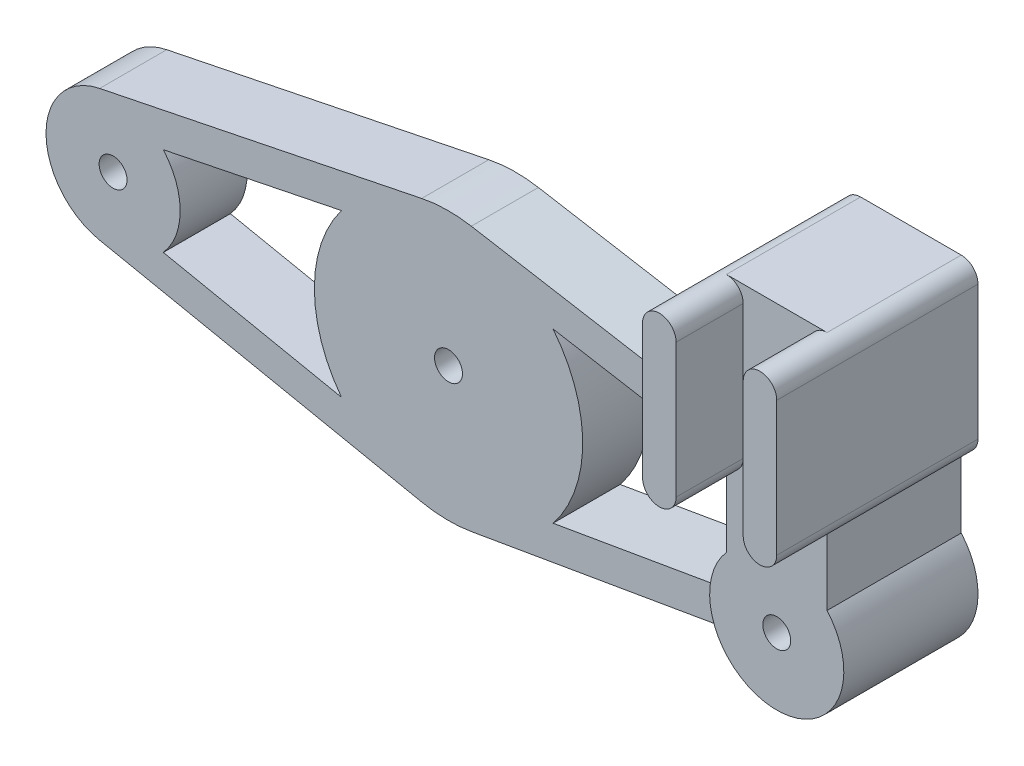
ISO-10303-21;
HEADER;
FILE_DESCRIPTION(('STEP AP214'),'2;1');
FILE_NAME('part.step','',(''),(''),'','','');
FILE_SCHEMA(('AUTOMOTIVE_DESIGN { 1 0 10303 214 1 1 1 1 }'));
ENDSEC;
DATA;
#1=APPLICATION_CONTEXT('core data for automotive mechanical design processes');
#2=APPLICATION_PROTOCOL_DEFINITION('international standard','automotive_design',2000,#1);
#3=PRODUCT_CONTEXT('',#1,'mechanical');
#4=PRODUCT('Part','Part','',(#3));
#5=PRODUCT_RELATED_PRODUCT_CATEGORY('part','',(#4));
#6=PRODUCT_DEFINITION_FORMATION('','',#4);
#7=PRODUCT_DEFINITION_CONTEXT('part definition',#1,'design');
#8=PRODUCT_DEFINITION('design','',#6,#7);
#9=PRODUCT_DEFINITION_SHAPE('','',#8);
#10=(LENGTH_UNIT() NAMED_UNIT(*) SI_UNIT(.MILLI.,.METRE.));
#11=(NAMED_UNIT(*) PLANE_ANGLE_UNIT() SI_UNIT($,.RADIAN.));
#12=(NAMED_UNIT(*) SI_UNIT($,.STERADIAN.) SOLID_ANGLE_UNIT());
#13=UNCERTAINTY_MEASURE_WITH_UNIT(LENGTH_MEASURE(1.E-05),#10,'distance_accuracy_value','');
#14=(GEOMETRIC_REPRESENTATION_CONTEXT(3) GLOBAL_UNCERTAINTY_ASSIGNED_CONTEXT((#13)) GLOBAL_UNIT_ASSIGNED_CONTEXT((#10,
#11,#12)) REPRESENTATION_CONTEXT('',''));
#15=CARTESIAN_POINT('',(0.,0.,0.));
#16=DIRECTION('',(0.,0.,1.));
#17=DIRECTION('',(1.,0.,0.));
#18=AXIS2_PLACEMENT_3D('',#15,#16,#17);
#19=CARTESIAN_POINT('',(70.7106781186548,0.,24.));
#20=DIRECTION('',(0.,0.,1.));
#21=DIRECTION('',(1.,0.,0.));
#22=AXIS2_PLACEMENT_3D('',#19,#20,#21);
#23=PLANE('',#22);
#24=CARTESIAN_POINT('',(70.7106781186548,0.,24.));
#25=DIRECTION('',(0.,0.,1.));
#26=DIRECTION('',(1.,0.,0.));
#27=AXIS2_PLACEMENT_3D('',#24,#25,#26);
#28=CIRCLE('',#27,2.5);
#29=CARTESIAN_POINT('',(73.2106781186548,0.,24.));
#30=VERTEX_POINT('',#29);
#31=EDGE_CURVE('E353',#30,#30,#28,.T.);
#32=ORIENTED_EDGE('',*,*,#31,.F.);
#33=EDGE_LOOP('',(#32));
#34=FACE_BOUND('',#33,.T.);
#35=DIRECTION('',(0.,-1.,0.));
#36=VECTOR('',#35,1.);
#37=CARTESIAN_POINT('',(79.7106781186548,7.67660141228624,24.));
#38=LINE('',#37,#36);
#39=CARTESIAN_POINT('',(79.7106781186548,21.,24.));
#40=VERTEX_POINT('',#39);
#41=CARTESIAN_POINT('',(79.7106781186548,7.93725393319377,24.));
#42=VERTEX_POINT('',#41);
#43=EDGE_CURVE('E318',#40,#42,#38,.T.);
#44=ORIENTED_EDGE('',*,*,#43,.F.);
#45=CARTESIAN_POINT('',(79.7106781186548,24.,24.));
#46=DIRECTION('',(0.,0.,1.));
#47=DIRECTION('',(1.,0.,0.));
#48=AXIS2_PLACEMENT_3D('',#45,#46,#47);
#49=CIRCLE('',#48,3.);
#50=CARTESIAN_POINT('',(76.7106781186548,24.,24.));
#51=VERTEX_POINT('',#50);
#52=EDGE_CURVE('E278',#40,#51,#49,.F.);
#53=ORIENTED_EDGE('',*,*,#52,.T.);
#54=DIRECTION('',(0.,1.,0.));
#55=VECTOR('',#54,1.);
#56=CARTESIAN_POINT('',(76.7106781186547,0.,24.));
#57=LINE('',#56,#55);
#58=CARTESIAN_POINT('',(76.7106781186548,48.,24.));
#59=VERTEX_POINT('',#58);
#60=EDGE_CURVE('E11',#51,#59,#57,.T.);
#61=ORIENTED_EDGE('',*,*,#60,.T.);
#62=CARTESIAN_POINT('',(79.7106781186548,48.,24.));
#63=DIRECTION('',(0.,0.,1.));
#64=DIRECTION('',(1.,0.,0.));
#65=AXIS2_PLACEMENT_3D('',#62,#63,#64);
#66=CIRCLE('',#65,2.99999999999998);
#67=CARTESIAN_POINT('',(79.7106781186548,51.,24.));
#68=VERTEX_POINT('',#67);
#69=EDGE_CURVE('E275',#59,#68,#66,.F.);
#70=ORIENTED_EDGE('',*,*,#69,.T.);
#71=DIRECTION('',(1.,0.,0.));
#72=VECTOR('',#71,1.);
#73=CARTESIAN_POINT('',(79.7106781186547,51.,24.));
#74=LINE('',#73,#72);
#75=CARTESIAN_POINT('',(61.7106781186547,51.,24.));
#76=VERTEX_POINT('',#75);
#77=EDGE_CURVE('E322',#76,#68,#74,.T.);
#78=ORIENTED_EDGE('',*,*,#77,.F.);
#79=CARTESIAN_POINT('',(61.7106781186547,48.,24.));
#80=DIRECTION('',(0.,0.,1.));
#81=DIRECTION('',(1.,0.,0.));
#82=AXIS2_PLACEMENT_3D('',#79,#80,#81);
#83=CIRCLE('',#82,2.99999999999998);
#84=CARTESIAN_POINT('',(64.7106781186547,48.,24.));
#85=VERTEX_POINT('',#84);
#86=EDGE_CURVE('E57',#76,#85,#83,.F.);
#87=ORIENTED_EDGE('',*,*,#86,.T.);
#88=DIRECTION('',(0.,-1.,0.));
#89=VECTOR('',#88,1.);
#90=CARTESIAN_POINT('',(64.7106781186548,0.,24.));
#91=LINE('',#90,#89);
#92=CARTESIAN_POINT('',(64.7106781186547,24.,24.));
#93=VERTEX_POINT('',#92);
#94=EDGE_CURVE('E52',#85,#93,#91,.T.);
#95=ORIENTED_EDGE('',*,*,#94,.T.);
#96=CARTESIAN_POINT('',(61.7106781186547,24.,24.));
#97=DIRECTION('',(0.,0.,1.));
#98=DIRECTION('',(1.,0.,0.));
#99=AXIS2_PLACEMENT_3D('',#96,#97,#98);
#100=CIRCLE('',#99,3.);
#101=CARTESIAN_POINT('',(61.7106781186547,21.,24.));
#102=VERTEX_POINT('',#101);
#103=EDGE_CURVE('E309',#93,#102,#100,.F.);
#104=ORIENTED_EDGE('',*,*,#103,.T.);
#105=DIRECTION('',(0.,1.,0.));
#106=VECTOR('',#105,1.);
#107=CARTESIAN_POINT('',(61.7106781186547,51.,24.));
#108=LINE('',#107,#106);
#109=CARTESIAN_POINT('',(61.7106781186547,7.93725393319376,24.));
#110=VERTEX_POINT('',#109);
#111=EDGE_CURVE('E313',#110,#102,#108,.T.);
#112=ORIENTED_EDGE('',*,*,#111,.F.);
#113=CARTESIAN_POINT('',(70.7106781186548,0.,24.));
#114=DIRECTION('',(0.,0.,1.));
#115=DIRECTION('',(1.,0.,0.));
#116=AXIS2_PLACEMENT_3D('',#113,#114,#115);
#117=CIRCLE('',#116,12.);
#118=EDGE_CURVE('E360',#110,#42,#117,.T.);
#119=ORIENTED_EDGE('',*,*,#118,.T.);
#120=EDGE_LOOP('',(#44,#53,#61,#70,#78,#87,#95,#104,#112,#119));
#121=FACE_BOUND('',#120,.T.);
#122=ADVANCED_FACE('F37',(#34,#121),#23,.T.);
#123=CARTESIAN_POINT('',(79.7106781186548,7.67660141228624,70.9139303958847));
#124=DIRECTION('',(1.,0.,0.));
#125=DIRECTION('',(0.,1.,0.));
#126=AXIS2_PLACEMENT_3D('',#123,#124,#125);
#127=PLANE('',#126);
#128=DIRECTION('',(0.,-1.,0.));
#129=VECTOR('',#128,1.);
#130=CARTESIAN_POINT('',(79.7106781186548,7.67660141228624,0.));
#131=LINE('',#130,#129);
#132=CARTESIAN_POINT('',(79.7106781186548,21.,0.));
#133=VERTEX_POINT('',#132);
#134=CARTESIAN_POINT('',(79.7106781186548,7.93725393319377,0.));
#135=VERTEX_POINT('',#134);
#136=EDGE_CURVE('E311',#133,#135,#131,.T.);
#137=ORIENTED_EDGE('',*,*,#136,.F.);
#138=DIRECTION('',(0.,0.,-1.));
#139=VECTOR('',#138,1.);
#140=CARTESIAN_POINT('',(79.7106781186548,21.,36.));
#141=LINE('',#140,#139);
#142=EDGE_CURVE('E45',#133,#40,#141,.F.);
#143=ORIENTED_EDGE('',*,*,#142,.T.);
#144=ORIENTED_EDGE('',*,*,#43,.T.);
#145=DIRECTION('',(0.,0.,-1.));
#146=VECTOR('',#145,1.);
#147=CARTESIAN_POINT('',(79.7106781186548,7.93725393319377,12.));
#148=LINE('',#147,#146);
#149=EDGE_CURVE('E320',#135,#42,#148,.F.);
#150=ORIENTED_EDGE('',*,*,#149,.F.);
#151=EDGE_LOOP('',(#137,#143,#144,#150));
#152=FACE_BOUND('',#151,.T.);
#153=ADVANCED_FACE('F485',(#152),#127,.T.);
#154=CARTESIAN_POINT('',(61.7106781186547,51.,70.9139303958847));
#155=DIRECTION('',(-1.,0.,0.));
#156=DIRECTION('',(0.,-1.,0.));
#157=AXIS2_PLACEMENT_3D('',#154,#155,#156);
#158=PLANE('',#157);
#159=ORIENTED_EDGE('',*,*,#111,.T.);
#160=DIRECTION('',(0.,0.,-1.));
#161=VECTOR('',#160,1.);
#162=CARTESIAN_POINT('',(61.7106781186547,21.,36.));
#163=LINE('',#162,#161);
#164=CARTESIAN_POINT('',(61.7106781186547,21.,0.));
#165=VERTEX_POINT('',#164);
#166=EDGE_CURVE('E479',#102,#165,#163,.T.);
#167=ORIENTED_EDGE('',*,*,#166,.T.);
#168=DIRECTION('',(0.,1.,0.));
#169=VECTOR('',#168,1.);
#170=CARTESIAN_POINT('',(61.7106781186547,51.,0.));
#171=LINE('',#170,#169);
#172=CARTESIAN_POINT('',(61.7106781186547,13.7264556374348,0.));
#173=VERTEX_POINT('',#172);
#174=EDGE_CURVE('E314',#173,#165,#171,.T.);
#175=ORIENTED_EDGE('',*,*,#174,.F.);
#176=DIRECTION('',(0.,0.,-1.));
#177=VECTOR('',#176,1.);
#178=CARTESIAN_POINT('',(61.7106781186547,13.7264556374348,12.));
#179=LINE('',#178,#177);
#180=CARTESIAN_POINT('',(61.7106781186547,13.7264556374348,12.));
#181=VERTEX_POINT('',#180);
#182=EDGE_CURVE('E333',#181,#173,#179,.T.);
#183=ORIENTED_EDGE('',*,*,#182,.F.);
#184=DIRECTION('',(0.,-1.,0.));
#185=VECTOR('',#184,1.);
#186=CARTESIAN_POINT('',(61.7106781186547,0.,12.));
#187=LINE('',#186,#185);
#188=CARTESIAN_POINT('',(61.7106781186547,7.93725393319376,12.));
#189=VERTEX_POINT('',#188);
#190=EDGE_CURVE('E336',#181,#189,#187,.T.);
#191=ORIENTED_EDGE('',*,*,#190,.T.);
#192=DIRECTION('',(0.,0.,-1.));
#193=VECTOR('',#192,1.);
#194=CARTESIAN_POINT('',(61.7106781186547,7.93725393319376,12.));
#195=LINE('',#194,#193);
#196=EDGE_CURVE('E338',#110,#189,#195,.T.);
#197=ORIENTED_EDGE('',*,*,#196,.F.);
#198=EDGE_LOOP('',(#159,#167,#175,#183,#191,#197));
#199=FACE_BOUND('',#198,.T.);
#200=ADVANCED_FACE('F524',(#199),#158,.T.);
#201=CARTESIAN_POINT('',(-60.,0.,12.));
#202=DIRECTION('',(0.,0.,1.));
#203=DIRECTION('',(1.,0.,0.));
#204=AXIS2_PLACEMENT_3D('',#201,#202,#203);
#205=PLANE('',#204);
#206=ORIENTED_EDGE('',*,*,#190,.F.);
#207=DIRECTION('',(-0.985494799580394,0.169705627484771,0.));
#208=VECTOR('',#207,1.);
#209=CARTESIAN_POINT('',(4.07293505963451,23.6518751899294,12.));
#210=LINE('',#209,#208);
#211=CARTESIAN_POINT('',(4.07293505963451,23.6518751899294,12.));
#212=VERTEX_POINT('',#211);
#213=EDGE_CURVE('E436',#181,#212,#210,.T.);
#214=ORIENTED_EDGE('',*,*,#213,.T.);
#215=CARTESIAN_POINT('',(0.,0.,12.));
#216=DIRECTION('',(0.,0.,1.));
#217=DIRECTION('',(1.,0.,0.));
#218=AXIS2_PLACEMENT_3D('',#215,#216,#217);
#219=CIRCLE('',#218,24.);
#220=CARTESIAN_POINT('',(-4.8,23.5151015307185,12.));
#221=VERTEX_POINT('',#220);
#222=EDGE_CURVE('E438',#212,#221,#219,.T.);
#223=ORIENTED_EDGE('',*,*,#222,.T.);
#224=DIRECTION('',(-0.979795897113271,-0.2,0.));
#225=VECTOR('',#224,1.);
#226=CARTESIAN_POINT('',(-62.4,11.7575507653593,12.));
#227=LINE('',#226,#225);
#228=CARTESIAN_POINT('',(-62.4,11.7575507653593,12.));
#229=VERTEX_POINT('',#228);
#230=EDGE_CURVE('E440',#221,#229,#227,.T.);
#231=ORIENTED_EDGE('',*,*,#230,.T.);
#232=CARTESIAN_POINT('',(-60.,0.,12.));
#233=DIRECTION('',(0.,0.,1.));
#234=DIRECTION('',(1.,0.,0.));
#235=AXIS2_PLACEMENT_3D('',#232,#233,#234);
#236=CIRCLE('',#235,12.);
#237=CARTESIAN_POINT('',(-62.4,-11.7575507653593,12.));
#238=VERTEX_POINT('',#237);
#239=EDGE_CURVE('E426',#229,#238,#236,.T.);
#240=ORIENTED_EDGE('',*,*,#239,.T.);
#241=DIRECTION('',(0.979795897113271,-0.2,0.));
#242=VECTOR('',#241,1.);
#243=CARTESIAN_POINT('',(-62.4,-11.7575507653593,12.));
#244=LINE('',#243,#242);
#245=CARTESIAN_POINT('',(-4.8,-23.5151015307185,12.));
#246=VERTEX_POINT('',#245);
#247=EDGE_CURVE('E429',#238,#246,#244,.T.);
#248=ORIENTED_EDGE('',*,*,#247,.T.);
#249=CARTESIAN_POINT('',(0.,0.,12.));
#250=DIRECTION('',(0.,0.,1.));
#251=DIRECTION('',(1.,0.,0.));
#252=AXIS2_PLACEMENT_3D('',#249,#250,#251);
#253=CIRCLE('',#252,24.);
#254=CARTESIAN_POINT('',(4.0729350596345,-23.6518751899294,12.));
#255=VERTEX_POINT('',#254);
#256=EDGE_CURVE('E432',#246,#255,#253,.T.);
#257=ORIENTED_EDGE('',*,*,#256,.T.);
#258=DIRECTION('',(0.985494799580394,0.169705627484772,0.));
#259=VECTOR('',#258,1.);
#260=CARTESIAN_POINT('',(72.747145648472,-11.8259375949647,12.));
#261=LINE('',#260,#259);
#262=CARTESIAN_POINT('',(72.747145648472,-11.8259375949647,12.));
#263=VERTEX_POINT('',#262);
#264=EDGE_CURVE('E434',#255,#263,#261,.T.);
#265=ORIENTED_EDGE('',*,*,#264,.T.);
#266=CARTESIAN_POINT('',(70.7106781186548,0.,12.));
#267=DIRECTION('',(0.,0.,1.));
#268=DIRECTION('',(1.,0.,0.));
#269=AXIS2_PLACEMENT_3D('',#266,#267,#268);
#270=CIRCLE('',#269,12.);
#271=CARTESIAN_POINT('',(61.4873495027545,-7.67660141228625,12.));
#272=VERTEX_POINT('',#271);
#273=EDGE_CURVE('E365',#272,#263,#270,.T.);
#274=ORIENTED_EDGE('',*,*,#273,.F.);
#275=DIRECTION('',(0.985494799580394,0.169705627484771,0.));
#276=VECTOR('',#275,1.);
#277=CARTESIAN_POINT('',(61.4873495027545,-7.67660141228625,12.));
#278=LINE('',#277,#276);
#279=CARTESIAN_POINT('',(18.6989462429489,-15.0449130739698,12.));
#280=VERTEX_POINT('',#279);
#281=EDGE_CURVE('E368',#280,#272,#278,.T.);
#282=ORIENTED_EDGE('',*,*,#281,.F.);
#283=CARTESIAN_POINT('',(0.,0.,12.));
#284=DIRECTION('',(0.,0.,-1.));
#285=DIRECTION('',(1.,0.,0.));
#286=AXIS2_PLACEMENT_3D('',#283,#284,#285);
#287=CIRCLE('',#286,24.);
#288=CARTESIAN_POINT('',(18.6989462429489,15.0449130739698,12.));
#289=VERTEX_POINT('',#288);
#290=EDGE_CURVE('E366',#289,#280,#287,.T.);
#291=ORIENTED_EDGE('',*,*,#290,.F.);
#292=DIRECTION('',(-0.985494799580394,0.169705627484771,0.));
#293=VECTOR('',#292,1.);
#294=CARTESIAN_POINT('',(18.6989462429489,15.0449130739698,12.));
#295=LINE('',#294,#293);
#296=CARTESIAN_POINT('',(61.4873495027545,7.67660141228625,12.));
#297=VERTEX_POINT('',#296);
#298=EDGE_CURVE('E372',#297,#289,#295,.T.);
#299=ORIENTED_EDGE('',*,*,#298,.F.);
#300=EDGE_CURVE('E359',#189,#297,#270,.T.);
#301=ORIENTED_EDGE('',*,*,#300,.F.);
#302=EDGE_LOOP('',(#206,#214,#223,#231,#240,#248,#257,#265,#274,#282,#291,#299,#301));
#303=FACE_BOUND('',#302,.T.);
#304=CARTESIAN_POINT('',(-60.,0.,12.));
#305=DIRECTION('',(0.,0.,1.));
#306=DIRECTION('',(1.,0.,0.));
#307=AXIS2_PLACEMENT_3D('',#304,#305,#306);
#308=CIRCLE('',#307,2.5);
#309=CARTESIAN_POINT('',(-57.5,0.,12.));
#310=VERTEX_POINT('',#309);
#311=EDGE_CURVE('E344',#310,#310,#308,.T.);
#312=ORIENTED_EDGE('',*,*,#311,.F.);
#313=EDGE_LOOP('',(#312));
#314=FACE_BOUND('',#313,.T.);
#315=CARTESIAN_POINT('',(0.,0.,12.));
#316=DIRECTION('',(0.,0.,1.));
#317=DIRECTION('',(1.,0.,0.));
#318=AXIS2_PLACEMENT_3D('',#315,#316,#317);
#319=CIRCLE('',#318,2.5);
#320=CARTESIAN_POINT('',(2.5,0.,12.));
#321=VERTEX_POINT('',#320);
#322=EDGE_CURVE('E350',#321,#321,#319,.T.);
#323=ORIENTED_EDGE('',*,*,#322,.F.);
#324=EDGE_LOOP('',(#323));
#325=FACE_BOUND('',#324,.T.);
#326=DIRECTION('',(-0.979795897113271,-0.2,0.));
#327=VECTOR('',#326,1.);
#328=CARTESIAN_POINT('',(-51.0176623509137,7.95723635176228,12.));
#329=LINE('',#328,#327);
#330=CARTESIAN_POINT('',(-19.1537776761789,14.4614245747614,12.));
#331=VERTEX_POINT('',#330);
#332=CARTESIAN_POINT('',(-51.0176623509137,7.95723635176228,12.));
#333=VERTEX_POINT('',#332);
#334=EDGE_CURVE('E397',#331,#333,#329,.T.);
#335=ORIENTED_EDGE('',*,*,#334,.F.);
#336=CARTESIAN_POINT('',(0.,0.,12.));
#337=DIRECTION('',(0.,0.,-1.));
#338=DIRECTION('',(1.,0.,0.));
#339=AXIS2_PLACEMENT_3D('',#336,#337,#338);
#340=CIRCLE('',#339,24.);
#341=CARTESIAN_POINT('',(-19.1537776761789,-14.4614245747614,12.));
#342=VERTEX_POINT('',#341);
#343=EDGE_CURVE('E395',#342,#331,#340,.T.);
#344=ORIENTED_EDGE('',*,*,#343,.F.);
#345=DIRECTION('',(0.979795897113271,-0.2,0.));
#346=VECTOR('',#345,1.);
#347=CARTESIAN_POINT('',(-51.0176623509137,-7.95723635176228,12.));
#348=LINE('',#347,#346);
#349=CARTESIAN_POINT('',(-51.0176623509137,-7.95723635176228,12.));
#350=VERTEX_POINT('',#349);
#351=EDGE_CURVE('E403',#350,#342,#348,.T.);
#352=ORIENTED_EDGE('',*,*,#351,.F.);
#353=CARTESIAN_POINT('',(-60.,0.,12.));
#354=DIRECTION('',(0.,0.,-1.));
#355=DIRECTION('',(1.,0.,0.));
#356=AXIS2_PLACEMENT_3D('',#353,#354,#355);
#357=CIRCLE('',#356,12.);
#358=EDGE_CURVE('E400',#333,#350,#357,.T.);
#359=ORIENTED_EDGE('',*,*,#358,.F.);
#360=EDGE_LOOP('',(#335,#344,#352,#359));
#361=FACE_BOUND('',#360,.T.);
#362=ADVANCED_FACE('F528',(#303,#314,#325,#361),#205,.T.);
#363=CARTESIAN_POINT('',(-60.,0.,0.));
#364=DIRECTION('',(0.,0.,1.));
#365=DIRECTION('',(1.,0.,0.));
#366=AXIS2_PLACEMENT_3D('',#363,#364,#365);
#367=PLANE('',#366);
#368=DIRECTION('',(1.,0.,0.));
#369=VECTOR('',#368,1.);
#370=CARTESIAN_POINT('',(79.7106781186547,51.,0.));
#371=LINE('',#370,#369);
#372=CARTESIAN_POINT('',(61.7106781186547,51.,0.));
#373=VERTEX_POINT('',#372);
#374=CARTESIAN_POINT('',(79.7106781186547,51.,0.));
#375=VERTEX_POINT('',#374);
#376=EDGE_CURVE('E241',#373,#375,#371,.T.);
#377=ORIENTED_EDGE('',*,*,#376,.T.);
#378=CARTESIAN_POINT('',(79.7106781186548,48.,0.));
#379=DIRECTION('',(0.,0.,1.));
#380=DIRECTION('',(1.,0.,0.));
#381=AXIS2_PLACEMENT_3D('',#378,#379,#380);
#382=CIRCLE('',#381,2.99999999999998);
#383=CARTESIAN_POINT('',(82.7106781186547,48.,0.));
#384=VERTEX_POINT('',#383);
#385=EDGE_CURVE('E232',#375,#384,#382,.F.);
#386=ORIENTED_EDGE('',*,*,#385,.T.);
#387=DIRECTION('',(0.,-1.,0.));
#388=VECTOR('',#387,1.);
#389=CARTESIAN_POINT('',(82.7106781186548,24.,0.));
#390=LINE('',#389,#388);
#391=CARTESIAN_POINT('',(82.7106781186548,24.,0.));
#392=VERTEX_POINT('',#391);
#393=EDGE_CURVE('E238',#384,#392,#390,.T.);
#394=ORIENTED_EDGE('',*,*,#393,.T.);
#395=CARTESIAN_POINT('',(79.7106781186548,24.,0.));
#396=DIRECTION('',(0.,0.,1.));
#397=DIRECTION('',(1.,0.,0.));
#398=AXIS2_PLACEMENT_3D('',#395,#396,#397);
#399=CIRCLE('',#398,3.);
#400=EDGE_CURVE('E244',#392,#133,#399,.F.);
#401=ORIENTED_EDGE('',*,*,#400,.T.);
#402=ORIENTED_EDGE('',*,*,#136,.T.);
#403=CARTESIAN_POINT('',(70.7106781186548,0.,0.));
#404=DIRECTION('',(0.,0.,1.));
#405=DIRECTION('',(1.,0.,0.));
#406=AXIS2_PLACEMENT_3D('',#403,#404,#405);
#407=CIRCLE('',#406,12.);
#408=CARTESIAN_POINT('',(72.747145648472,-11.8259375949647,0.));
#409=VERTEX_POINT('',#408);
#410=EDGE_CURVE('E451',#409,#135,#407,.T.);
#411=ORIENTED_EDGE('',*,*,#410,.F.);
#412=DIRECTION('',(0.985494799580394,0.169705627484772,0.));
#413=VECTOR('',#412,1.);
#414=CARTESIAN_POINT('',(72.747145648472,-11.8259375949647,0.));
#415=LINE('',#414,#413);
#416=CARTESIAN_POINT('',(4.0729350596345,-23.6518751899294,0.));
#417=VERTEX_POINT('',#416);
#418=EDGE_CURVE('E449',#417,#409,#415,.T.);
#419=ORIENTED_EDGE('',*,*,#418,.F.);
#420=CARTESIAN_POINT('',(0.,0.,0.));
#421=DIRECTION('',(0.,0.,1.));
#422=DIRECTION('',(1.,0.,0.));
#423=AXIS2_PLACEMENT_3D('',#420,#421,#422);
#424=CIRCLE('',#423,24.);
#425=CARTESIAN_POINT('',(-4.8,-23.5151015307185,0.));
#426=VERTEX_POINT('',#425);
#427=EDGE_CURVE('E447',#426,#417,#424,.T.);
#428=ORIENTED_EDGE('',*,*,#427,.F.);
#429=DIRECTION('',(0.979795897113271,-0.2,0.));
#430=VECTOR('',#429,1.);
#431=CARTESIAN_POINT('',(-62.4,-11.7575507653593,0.));
#432=LINE('',#431,#430);
#433=CARTESIAN_POINT('',(-62.4,-11.7575507653593,0.));
#434=VERTEX_POINT('',#433);
#435=EDGE_CURVE('E445',#434,#426,#432,.T.);
#436=ORIENTED_EDGE('',*,*,#435,.F.);
#437=CARTESIAN_POINT('',(-60.,0.,0.));
#438=DIRECTION('',(0.,0.,1.));
#439=DIRECTION('',(1.,0.,0.));
#440=AXIS2_PLACEMENT_3D('',#437,#438,#439);
#441=CIRCLE('',#440,12.);
#442=CARTESIAN_POINT('',(-62.4,11.7575507653593,0.));
#443=VERTEX_POINT('',#442);
#444=EDGE_CURVE('E425',#443,#434,#441,.T.);
#445=ORIENTED_EDGE('',*,*,#444,.F.);
#446=DIRECTION('',(-0.979795897113271,-0.2,0.));
#447=VECTOR('',#446,1.);
#448=CARTESIAN_POINT('',(-62.4,11.7575507653593,0.));
#449=LINE('',#448,#447);
#450=CARTESIAN_POINT('',(-4.8,23.5151015307185,0.));
#451=VERTEX_POINT('',#450);
#452=EDGE_CURVE('E430',#451,#443,#449,.T.);
#453=ORIENTED_EDGE('',*,*,#452,.F.);
#454=CARTESIAN_POINT('',(0.,0.,0.));
#455=DIRECTION('',(0.,0.,1.));
#456=DIRECTION('',(1.,0.,0.));
#457=AXIS2_PLACEMENT_3D('',#454,#455,#456);
#458=CIRCLE('',#457,24.);
#459=CARTESIAN_POINT('',(4.07293505963451,23.6518751899294,0.));
#460=VERTEX_POINT('',#459);
#461=EDGE_CURVE('E456',#460,#451,#458,.T.);
#462=ORIENTED_EDGE('',*,*,#461,.F.);
#463=DIRECTION('',(-0.985494799580394,0.169705627484771,0.));
#464=VECTOR('',#463,1.);
#465=CARTESIAN_POINT('',(4.07293505963451,23.6518751899294,0.));
#466=LINE('',#465,#464);
#467=EDGE_CURVE('E454',#173,#460,#466,.T.);
#468=ORIENTED_EDGE('',*,*,#467,.F.);
#469=ORIENTED_EDGE('',*,*,#174,.T.);
#470=CARTESIAN_POINT('',(61.7106781186547,24.,0.));
#471=DIRECTION('',(0.,0.,1.));
#472=DIRECTION('',(1.,0.,0.));
#473=AXIS2_PLACEMENT_3D('',#470,#471,#472);
#474=CIRCLE('',#473,3.);
#475=CARTESIAN_POINT('',(58.7106781186547,24.,0.));
#476=VERTEX_POINT('',#475);
#477=EDGE_CURVE('E286',#165,#476,#474,.F.);
#478=ORIENTED_EDGE('',*,*,#477,.T.);
#479=DIRECTION('',(0.,1.,0.));
#480=VECTOR('',#479,1.);
#481=CARTESIAN_POINT('',(58.7106781186547,24.,0.));
#482=LINE('',#481,#480);
#483=CARTESIAN_POINT('',(58.7106781186548,48.,0.));
#484=VERTEX_POINT('',#483);
#485=EDGE_CURVE('E283',#476,#484,#482,.T.);
#486=ORIENTED_EDGE('',*,*,#485,.T.);
#487=CARTESIAN_POINT('',(61.7106781186547,48.,0.));
#488=DIRECTION('',(0.,0.,1.));
#489=DIRECTION('',(1.,0.,0.));
#490=AXIS2_PLACEMENT_3D('',#487,#488,#489);
#491=CIRCLE('',#490,2.99999999999998);
#492=EDGE_CURVE('E281',#484,#373,#491,.F.);
#493=ORIENTED_EDGE('',*,*,#492,.T.);
#494=EDGE_LOOP('',(#377,#386,#394,#401,#402,#411,#419,#428,#436,#445,#453,#462,#468,#469,#478,
#486,#493));
#495=FACE_BOUND('',#494,.T.);
#496=CARTESIAN_POINT('',(0.,0.,0.));
#497=DIRECTION('',(0.,0.,-1.));
#498=DIRECTION('',(1.,0.,0.));
#499=AXIS2_PLACEMENT_3D('',#496,#497,#498);
#500=CIRCLE('',#499,24.);
#501=CARTESIAN_POINT('',(18.6989462429489,15.0449130739698,0.));
#502=VERTEX_POINT('',#501);
#503=CARTESIAN_POINT('',(18.6989462429489,-15.0449130739698,0.));
#504=VERTEX_POINT('',#503);
#505=EDGE_CURVE('E363',#502,#504,#500,.T.);
#506=ORIENTED_EDGE('',*,*,#505,.T.);
#507=DIRECTION('',(0.985494799580394,0.169705627484771,0.));
#508=VECTOR('',#507,1.);
#509=CARTESIAN_POINT('',(61.4873495027545,-7.67660141228625,0.));
#510=LINE('',#509,#508);
#511=CARTESIAN_POINT('',(61.4873495027545,-7.67660141228625,0.));
#512=VERTEX_POINT('',#511);
#513=EDGE_CURVE('E377',#504,#512,#510,.T.);
#514=ORIENTED_EDGE('',*,*,#513,.T.);
#515=CARTESIAN_POINT('',(70.7106781186548,0.,0.));
#516=DIRECTION('',(0.,0.,-1.));
#517=DIRECTION('',(1.,0.,0.));
#518=AXIS2_PLACEMENT_3D('',#515,#516,#517);
#519=CIRCLE('',#518,12.);
#520=CARTESIAN_POINT('',(61.4873495027545,7.67660141228624,0.));
#521=VERTEX_POINT('',#520);
#522=EDGE_CURVE('E380',#512,#521,#519,.T.);
#523=ORIENTED_EDGE('',*,*,#522,.T.);
#524=DIRECTION('',(-0.985494799580394,0.169705627484771,0.));
#525=VECTOR('',#524,1.);
#526=CARTESIAN_POINT('',(18.6989462429489,15.0449130739698,0.));
#527=LINE('',#526,#525);
#528=EDGE_CURVE('E369',#521,#502,#527,.T.);
#529=ORIENTED_EDGE('',*,*,#528,.T.);
#530=EDGE_LOOP('',(#506,#514,#523,#529));
#531=FACE_BOUND('',#530,.T.);
#532=CARTESIAN_POINT('',(0.,0.,0.));
#533=DIRECTION('',(0.,0.,-1.));
#534=DIRECTION('',(1.,0.,0.));
#535=AXIS2_PLACEMENT_3D('',#532,#533,#534);
#536=CIRCLE('',#535,24.);
#537=CARTESIAN_POINT('',(-19.1537776761789,-14.4614245747614,0.));
#538=VERTEX_POINT('',#537);
#539=CARTESIAN_POINT('',(-19.1537776761789,14.4614245747614,0.));
#540=VERTEX_POINT('',#539);
#541=EDGE_CURVE('E394',#538,#540,#536,.T.);
#542=ORIENTED_EDGE('',*,*,#541,.T.);
#543=DIRECTION('',(-0.979795897113271,-0.2,0.));
#544=VECTOR('',#543,1.);
#545=CARTESIAN_POINT('',(-51.0176623509137,7.95723635176228,0.));
#546=LINE('',#545,#544);
#547=CARTESIAN_POINT('',(-51.0176623509137,7.95723635176228,0.));
#548=VERTEX_POINT('',#547);
#549=EDGE_CURVE('E408',#540,#548,#546,.T.);
#550=ORIENTED_EDGE('',*,*,#549,.T.);
#551=CARTESIAN_POINT('',(-60.,0.,0.));
#552=DIRECTION('',(0.,0.,-1.));
#553=DIRECTION('',(1.,0.,0.));
#554=AXIS2_PLACEMENT_3D('',#551,#552,#553);
#555=CIRCLE('',#554,12.);
#556=CARTESIAN_POINT('',(-51.0176623509137,-7.95723635176228,0.));
#557=VERTEX_POINT('',#556);
#558=EDGE_CURVE('E411',#548,#557,#555,.T.);
#559=ORIENTED_EDGE('',*,*,#558,.T.);
#560=DIRECTION('',(0.979795897113271,-0.2,0.));
#561=VECTOR('',#560,1.);
#562=CARTESIAN_POINT('',(-51.0176623509137,-7.95723635176228,0.));
#563=LINE('',#562,#561);
#564=EDGE_CURVE('E398',#557,#538,#563,.T.);
#565=ORIENTED_EDGE('',*,*,#564,.T.);
#566=EDGE_LOOP('',(#542,#550,#559,#565));
#567=FACE_BOUND('',#566,.T.);
#568=CARTESIAN_POINT('',(70.7106781186548,0.,0.));
#569=DIRECTION('',(0.,0.,1.));
#570=DIRECTION('',(1.,0.,0.));
#571=AXIS2_PLACEMENT_3D('',#568,#569,#570);
#572=CIRCLE('',#571,2.49999999999999);
#573=CARTESIAN_POINT('',(73.2106781186547,0.,0.));
#574=VERTEX_POINT('',#573);
#575=EDGE_CURVE('E356',#574,#574,#572,.T.);
#576=ORIENTED_EDGE('',*,*,#575,.T.);
#577=EDGE_LOOP('',(#576));
#578=FACE_BOUND('',#577,.T.);
#579=CARTESIAN_POINT('',(0.,0.,0.));
#580=DIRECTION('',(0.,0.,1.));
#581=DIRECTION('',(1.,0.,0.));
#582=AXIS2_PLACEMENT_3D('',#579,#580,#581);
#583=CIRCLE('',#582,2.49999999999999);
#584=CARTESIAN_POINT('',(2.49999999999999,0.,0.));
#585=VERTEX_POINT('',#584);
#586=EDGE_CURVE('E347',#585,#585,#583,.T.);
#587=ORIENTED_EDGE('',*,*,#586,.T.);
#588=EDGE_LOOP('',(#587));
#589=FACE_BOUND('',#588,.T.);
#590=CARTESIAN_POINT('',(-60.,0.,0.));
#591=DIRECTION('',(0.,0.,1.));
#592=DIRECTION('',(1.,0.,0.));
#593=AXIS2_PLACEMENT_3D('',#590,#591,#592);
#594=CIRCLE('',#593,2.5);
#595=CARTESIAN_POINT('',(-57.5,0.,0.));
#596=VERTEX_POINT('',#595);
#597=EDGE_CURVE('E341',#596,#596,#594,.T.);
#598=ORIENTED_EDGE('',*,*,#597,.T.);
#599=EDGE_LOOP('',(#598));
#600=FACE_BOUND('',#599,.T.);
#601=ADVANCED_FACE('F234',(#495,#531,#567,#578,#589,#600),#367,.F.);
#602=CARTESIAN_POINT('',(-60.,0.,12.));
#603=DIRECTION('',(0.,0.,-1.));
#604=DIRECTION('',(-1.,0.,0.));
#605=AXIS2_PLACEMENT_3D('',#602,#603,#604);
#606=CYLINDRICAL_SURFACE('',#605,12.);
#607=ORIENTED_EDGE('',*,*,#444,.T.);
#608=DIRECTION('',(0.,0.,-1.));
#609=VECTOR('',#608,1.);
#610=CARTESIAN_POINT('',(-62.4,-11.7575507653593,12.));
#611=LINE('',#610,#609);
#612=EDGE_CURVE('E476',#238,#434,#611,.T.);
#613=ORIENTED_EDGE('',*,*,#612,.F.);
#614=ORIENTED_EDGE('',*,*,#239,.F.);
#615=DIRECTION('',(0.,0.,-1.));
#616=VECTOR('',#615,1.);
#617=CARTESIAN_POINT('',(-62.4,11.7575507653593,12.));
#618=LINE('',#617,#616);
#619=EDGE_CURVE('E442',#229,#443,#618,.T.);
#620=ORIENTED_EDGE('',*,*,#619,.T.);
#621=EDGE_LOOP('',(#607,#613,#614,#620));
#622=FACE_BOUND('',#621,.T.);
#623=ADVANCED_FACE('F39',(#622),#606,.T.);
#624=CARTESIAN_POINT('',(-62.4,-11.7575507653593,12.));
#625=DIRECTION('',(0.2,0.979795897113271,0.));
#626=DIRECTION('',(-0.979795897113271,0.2,0.));
#627=AXIS2_PLACEMENT_3D('',#624,#625,#626);
#628=PLANE('',#627);
#629=ORIENTED_EDGE('',*,*,#435,.T.);
#630=DIRECTION('',(0.,0.,-1.));
#631=VECTOR('',#630,1.);
#632=CARTESIAN_POINT('',(-4.8,-23.5151015307185,12.));
#633=LINE('',#632,#631);
#634=EDGE_CURVE('E473',#246,#426,#633,.T.);
#635=ORIENTED_EDGE('',*,*,#634,.F.);
#636=ORIENTED_EDGE('',*,*,#247,.F.);
#637=ORIENTED_EDGE('',*,*,#612,.T.);
#638=EDGE_LOOP('',(#629,#635,#636,#637));
#639=FACE_BOUND('',#638,.T.);
#640=ADVANCED_FACE('F550',(#639),#628,.F.);
#641=CARTESIAN_POINT('',(0.,0.,12.));
#642=DIRECTION('',(0.,0.,-1.));
#643=DIRECTION('',(-1.,0.,0.));
#644=AXIS2_PLACEMENT_3D('',#641,#642,#643);
#645=CYLINDRICAL_SURFACE('',#644,24.);
#646=ORIENTED_EDGE('',*,*,#427,.T.);
#647=DIRECTION('',(0.,0.,-1.));
#648=VECTOR('',#647,1.);
#649=CARTESIAN_POINT('',(4.0729350596345,-23.6518751899294,12.));
#650=LINE('',#649,#648);
#651=EDGE_CURVE('E470',#255,#417,#650,.T.);
#652=ORIENTED_EDGE('',*,*,#651,.F.);
#653=ORIENTED_EDGE('',*,*,#256,.F.);
#654=ORIENTED_EDGE('',*,*,#634,.T.);
#655=EDGE_LOOP('',(#646,#652,#653,#654));
#656=FACE_BOUND('',#655,.T.);
#657=ADVANCED_FACE('F556',(#656),#645,.T.);
#658=CARTESIAN_POINT('',(72.747145648472,-11.8259375949647,12.));
#659=DIRECTION('',(-0.169705627484771,0.985494799580393,0.));
#660=DIRECTION('',(-0.985494799580394,-0.169705627484772,0.));
#661=AXIS2_PLACEMENT_3D('',#658,#659,#660);
#662=PLANE('',#661);
#663=ORIENTED_EDGE('',*,*,#418,.T.);
#664=DIRECTION('',(0.,0.,-1.));
#665=VECTOR('',#664,1.);
#666=CARTESIAN_POINT('',(72.747145648472,-11.8259375949647,12.));
#667=LINE('',#666,#665);
#668=EDGE_CURVE('E467',#263,#409,#667,.T.);
#669=ORIENTED_EDGE('',*,*,#668,.F.);
#670=ORIENTED_EDGE('',*,*,#264,.F.);
#671=ORIENTED_EDGE('',*,*,#651,.T.);
#672=EDGE_LOOP('',(#663,#669,#670,#671));
#673=FACE_BOUND('',#672,.T.);
#674=ADVANCED_FACE('F558',(#673),#662,.F.);
#675=CARTESIAN_POINT('',(70.7106781186548,0.,12.));
#676=DIRECTION('',(0.,0.,-1.));
#677=DIRECTION('',(-1.,0.,0.));
#678=AXIS2_PLACEMENT_3D('',#675,#676,#677);
#679=CYLINDRICAL_SURFACE('',#678,12.);
#680=ORIENTED_EDGE('',*,*,#118,.F.);
#681=ORIENTED_EDGE('',*,*,#196,.T.);
#682=ORIENTED_EDGE('',*,*,#300,.T.);
#683=DIRECTION('',(0.,0.,-1.));
#684=VECTOR('',#683,1.);
#685=CARTESIAN_POINT('',(61.4873495027545,7.67660141228624,12.));
#686=LINE('',#685,#684);
#687=EDGE_CURVE('E387',#297,#521,#686,.T.);
#688=ORIENTED_EDGE('',*,*,#687,.T.);
#689=ORIENTED_EDGE('',*,*,#522,.F.);
#690=DIRECTION('',(0.,0.,-1.));
#691=VECTOR('',#690,1.);
#692=CARTESIAN_POINT('',(61.4873495027545,-7.67660141228625,12.));
#693=LINE('',#692,#691);
#694=EDGE_CURVE('E389',#272,#512,#693,.T.);
#695=ORIENTED_EDGE('',*,*,#694,.F.);
#696=ORIENTED_EDGE('',*,*,#273,.T.);
#697=ORIENTED_EDGE('',*,*,#668,.T.);
#698=ORIENTED_EDGE('',*,*,#410,.T.);
#699=ORIENTED_EDGE('',*,*,#149,.T.);
#700=EDGE_LOOP('',(#680,#681,#682,#688,#689,#695,#696,#697,#698,#699));
#701=FACE_BOUND('',#700,.T.);
#702=ADVANCED_FACE('F491',(#701),#679,.T.);
#703=CARTESIAN_POINT('',(4.07293505963451,23.6518751899294,12.));
#704=DIRECTION('',(-0.169705627484771,-0.985494799580393,0.));
#705=DIRECTION('',(0.985494799580394,-0.169705627484771,0.));
#706=AXIS2_PLACEMENT_3D('',#703,#704,#705);
#707=PLANE('',#706);
#708=ORIENTED_EDGE('',*,*,#213,.F.);
#709=ORIENTED_EDGE('',*,*,#182,.T.);
#710=ORIENTED_EDGE('',*,*,#467,.T.);
#711=DIRECTION('',(0.,0.,-1.));
#712=VECTOR('',#711,1.);
#713=CARTESIAN_POINT('',(4.07293505963451,23.6518751899294,12.));
#714=LINE('',#713,#712);
#715=EDGE_CURVE('E464',#212,#460,#714,.T.);
#716=ORIENTED_EDGE('',*,*,#715,.F.);
#717=EDGE_LOOP('',(#708,#709,#710,#716));
#718=FACE_BOUND('',#717,.T.);
#719=ADVANCED_FACE('F533',(#718),#707,.F.);
#720=CARTESIAN_POINT('',(0.,0.,12.));
#721=DIRECTION('',(0.,0.,-1.));
#722=DIRECTION('',(-1.,0.,0.));
#723=AXIS2_PLACEMENT_3D('',#720,#721,#722);
#724=CYLINDRICAL_SURFACE('',#723,24.);
#725=ORIENTED_EDGE('',*,*,#461,.T.);
#726=DIRECTION('',(0.,0.,-1.));
#727=VECTOR('',#726,1.);
#728=CARTESIAN_POINT('',(-4.8,23.5151015307185,12.));
#729=LINE('',#728,#727);
#730=EDGE_CURVE('E461',#221,#451,#729,.T.);
#731=ORIENTED_EDGE('',*,*,#730,.F.);
#732=ORIENTED_EDGE('',*,*,#222,.F.);
#733=ORIENTED_EDGE('',*,*,#715,.T.);
#734=EDGE_LOOP('',(#725,#731,#732,#733));
#735=FACE_BOUND('',#734,.T.);
#736=ADVANCED_FACE('F539',(#735),#724,.T.);
#737=CARTESIAN_POINT('',(-62.4,11.7575507653593,12.));
#738=DIRECTION('',(0.2,-0.979795897113271,0.));
#739=DIRECTION('',(0.979795897113271,0.2,0.));
#740=AXIS2_PLACEMENT_3D('',#737,#738,#739);
#741=PLANE('',#740);
#742=ORIENTED_EDGE('',*,*,#452,.T.);
#743=ORIENTED_EDGE('',*,*,#619,.F.);
#744=ORIENTED_EDGE('',*,*,#230,.F.);
#745=ORIENTED_EDGE('',*,*,#730,.T.);
#746=EDGE_LOOP('',(#742,#743,#744,#745));
#747=FACE_BOUND('',#746,.T.);
#748=ADVANCED_FACE('F545',(#747),#741,.F.);
#749=CARTESIAN_POINT('',(0.,0.,12.));
#750=DIRECTION('',(0.,0.,-1.));
#751=DIRECTION('',(-1.,0.,0.));
#752=AXIS2_PLACEMENT_3D('',#749,#750,#751);
#753=CYLINDRICAL_SURFACE('',#752,24.);
#754=ORIENTED_EDGE('',*,*,#541,.F.);
#755=DIRECTION('',(0.,0.,-1.));
#756=VECTOR('',#755,1.);
#757=CARTESIAN_POINT('',(-19.1537776761789,-14.4614245747614,12.));
#758=LINE('',#757,#756);
#759=EDGE_CURVE('E405',#342,#538,#758,.T.);
#760=ORIENTED_EDGE('',*,*,#759,.F.);
#761=ORIENTED_EDGE('',*,*,#343,.T.);
#762=DIRECTION('',(0.,0.,-1.));
#763=VECTOR('',#762,1.);
#764=CARTESIAN_POINT('',(-19.1537776761789,14.4614245747614,12.));
#765=LINE('',#764,#763);
#766=EDGE_CURVE('E422',#331,#540,#765,.T.);
#767=ORIENTED_EDGE('',*,*,#766,.T.);
#768=EDGE_LOOP('',(#754,#760,#761,#767));
#769=FACE_BOUND('',#768,.T.);
#770=ADVANCED_FACE('F759',(#769),#753,.T.);
#771=CARTESIAN_POINT('',(-51.0176623509137,7.95723635176228,12.));
#772=DIRECTION('',(0.2,-0.979795897113271,0.));
#773=DIRECTION('',(0.979795897113271,0.2,0.));
#774=AXIS2_PLACEMENT_3D('',#771,#772,#773);
#775=PLANE('',#774);
#776=ORIENTED_EDGE('',*,*,#549,.F.);
#777=ORIENTED_EDGE('',*,*,#766,.F.);
#778=ORIENTED_EDGE('',*,*,#334,.T.);
#779=DIRECTION('',(0.,0.,-1.));
#780=VECTOR('',#779,1.);
#781=CARTESIAN_POINT('',(-51.0176623509137,7.95723635176228,12.));
#782=LINE('',#781,#780);
#783=EDGE_CURVE('E420',#333,#548,#782,.T.);
#784=ORIENTED_EDGE('',*,*,#783,.T.);
#785=EDGE_LOOP('',(#776,#777,#778,#784));
#786=FACE_BOUND('',#785,.T.);
#787=ADVANCED_FACE('F766',(#786),#775,.T.);
#788=CARTESIAN_POINT('',(-60.,0.,12.));
#789=DIRECTION('',(0.,0.,-1.));
#790=DIRECTION('',(-1.,0.,0.));
#791=AXIS2_PLACEMENT_3D('',#788,#789,#790);
#792=CYLINDRICAL_SURFACE('',#791,12.);
#793=ORIENTED_EDGE('',*,*,#558,.F.);
#794=ORIENTED_EDGE('',*,*,#783,.F.);
#795=ORIENTED_EDGE('',*,*,#358,.T.);
#796=DIRECTION('',(0.,0.,-1.));
#797=VECTOR('',#796,1.);
#798=CARTESIAN_POINT('',(-51.0176623509137,-7.95723635176228,12.));
#799=LINE('',#798,#797);
#800=EDGE_CURVE('E418',#350,#557,#799,.T.);
#801=ORIENTED_EDGE('',*,*,#800,.T.);
#802=EDGE_LOOP('',(#793,#794,#795,#801));
#803=FACE_BOUND('',#802,.T.);
#804=ADVANCED_FACE('F774',(#803),#792,.T.);
#805=CARTESIAN_POINT('',(-51.0176623509137,-7.95723635176228,12.));
#806=DIRECTION('',(0.2,0.979795897113271,0.));
#807=DIRECTION('',(-0.979795897113271,0.2,0.));
#808=AXIS2_PLACEMENT_3D('',#805,#806,#807);
#809=PLANE('',#808);
#810=ORIENTED_EDGE('',*,*,#564,.F.);
#811=ORIENTED_EDGE('',*,*,#800,.F.);
#812=ORIENTED_EDGE('',*,*,#351,.T.);
#813=ORIENTED_EDGE('',*,*,#759,.T.);
#814=EDGE_LOOP('',(#810,#811,#812,#813));
#815=FACE_BOUND('',#814,.T.);
#816=ADVANCED_FACE('F782',(#815),#809,.T.);
#817=CARTESIAN_POINT('',(0.,0.,12.));
#818=DIRECTION('',(0.,0.,-1.));
#819=DIRECTION('',(-1.,0.,0.));
#820=AXIS2_PLACEMENT_3D('',#817,#818,#819);
#821=CYLINDRICAL_SURFACE('',#820,24.);
#822=ORIENTED_EDGE('',*,*,#505,.F.);
#823=DIRECTION('',(0.,0.,-1.));
#824=VECTOR('',#823,1.);
#825=CARTESIAN_POINT('',(18.6989462429489,15.0449130739698,12.));
#826=LINE('',#825,#824);
#827=EDGE_CURVE('E374',#289,#502,#826,.T.);
#828=ORIENTED_EDGE('',*,*,#827,.F.);
#829=ORIENTED_EDGE('',*,*,#290,.T.);
#830=DIRECTION('',(0.,0.,-1.));
#831=VECTOR('',#830,1.);
#832=CARTESIAN_POINT('',(18.6989462429489,-15.0449130739698,12.));
#833=LINE('',#832,#831);
#834=EDGE_CURVE('E391',#280,#504,#833,.T.);
#835=ORIENTED_EDGE('',*,*,#834,.T.);
#836=EDGE_LOOP('',(#822,#828,#829,#835));
#837=FACE_BOUND('',#836,.T.);
#838=ADVANCED_FACE('F567',(#837),#821,.T.);
#839=CARTESIAN_POINT('',(61.4873495027545,-7.67660141228625,12.));
#840=DIRECTION('',(-0.169705627484771,0.985494799580394,0.));
#841=DIRECTION('',(-0.985494799580394,-0.169705627484771,0.));
#842=AXIS2_PLACEMENT_3D('',#839,#840,#841);
#843=PLANE('',#842);
#844=ORIENTED_EDGE('',*,*,#513,.F.);
#845=ORIENTED_EDGE('',*,*,#834,.F.);
#846=ORIENTED_EDGE('',*,*,#281,.T.);
#847=ORIENTED_EDGE('',*,*,#694,.T.);
#848=EDGE_LOOP('',(#844,#845,#846,#847));
#849=FACE_BOUND('',#848,.T.);
#850=ADVANCED_FACE('F565',(#849),#843,.T.);
#851=CARTESIAN_POINT('',(18.6989462429489,15.0449130739698,12.));
#852=DIRECTION('',(-0.169705627484771,-0.985494799580393,0.));
#853=DIRECTION('',(0.985494799580394,-0.169705627484771,0.));
#854=AXIS2_PLACEMENT_3D('',#851,#852,#853);
#855=PLANE('',#854);
#856=ORIENTED_EDGE('',*,*,#528,.F.);
#857=ORIENTED_EDGE('',*,*,#687,.F.);
#858=ORIENTED_EDGE('',*,*,#298,.T.);
#859=ORIENTED_EDGE('',*,*,#827,.T.);
#860=EDGE_LOOP('',(#856,#857,#858,#859));
#861=FACE_BOUND('',#860,.T.);
#862=ADVANCED_FACE('F573',(#861),#855,.T.);
#863=CARTESIAN_POINT('',(70.7106781186548,0.,24.));
#864=DIRECTION('',(0.,0.,1.));
#865=DIRECTION('',(1.,0.,0.));
#866=AXIS2_PLACEMENT_3D('',#863,#864,#865);
#867=CYLINDRICAL_SURFACE('',#866,2.5);
#868=ORIENTED_EDGE('',*,*,#575,.F.);
#869=EDGE_LOOP('',(#868));
#870=FACE_BOUND('',#869,.T.);
#871=ORIENTED_EDGE('',*,*,#31,.T.);
#872=EDGE_LOOP('',(#871));
#873=FACE_BOUND('',#872,.T.);
#874=ADVANCED_FACE('F575',(#870,#873),#867,.F.);
#875=CARTESIAN_POINT('',(0.,0.,24.));
#876=DIRECTION('',(0.,0.,1.));
#877=DIRECTION('',(1.,0.,0.));
#878=AXIS2_PLACEMENT_3D('',#875,#876,#877);
#879=CYLINDRICAL_SURFACE('',#878,2.5);
#880=ORIENTED_EDGE('',*,*,#322,.T.);
#881=EDGE_LOOP('',(#880));
#882=FACE_BOUND('',#881,.T.);
#883=ORIENTED_EDGE('',*,*,#586,.F.);
#884=EDGE_LOOP('',(#883));
#885=FACE_BOUND('',#884,.T.);
#886=ADVANCED_FACE('F581',(#882,#885),#879,.F.);
#887=CARTESIAN_POINT('',(-60.,0.,24.));
#888=DIRECTION('',(0.,0.,1.));
#889=DIRECTION('',(1.,0.,0.));
#890=AXIS2_PLACEMENT_3D('',#887,#888,#889);
#891=CYLINDRICAL_SURFACE('',#890,2.5);
#892=ORIENTED_EDGE('',*,*,#311,.T.);
#893=EDGE_LOOP('',(#892));
#894=FACE_BOUND('',#893,.T.);
#895=ORIENTED_EDGE('',*,*,#597,.F.);
#896=EDGE_LOOP('',(#895));
#897=FACE_BOUND('',#896,.T.);
#898=ADVANCED_FACE('F596',(#894,#897),#891,.F.);
#899=CARTESIAN_POINT('',(79.7106781186547,51.,70.9139303958847));
#900=DIRECTION('',(0.,1.,0.));
#901=DIRECTION('',(0.,0.,1.));
#902=AXIS2_PLACEMENT_3D('',#899,#900,#901);
#903=PLANE('',#902);
#904=DIRECTION('',(0.,0.,-1.));
#905=VECTOR('',#904,1.);
#906=CARTESIAN_POINT('',(61.7106781186547,51.,70.9139303958847));
#907=LINE('',#906,#905);
#908=EDGE_CURVE('E325',#76,#373,#907,.T.);
#909=ORIENTED_EDGE('',*,*,#908,.F.);
#910=ORIENTED_EDGE('',*,*,#77,.T.);
#911=DIRECTION('',(0.,0.,-1.));
#912=VECTOR('',#911,1.);
#913=CARTESIAN_POINT('',(79.7106781186547,51.,70.9139303958847));
#914=LINE('',#913,#912);
#915=EDGE_CURVE('E321',#68,#375,#914,.T.);
#916=ORIENTED_EDGE('',*,*,#915,.T.);
#917=ORIENTED_EDGE('',*,*,#376,.F.);
#918=EDGE_LOOP('',(#909,#910,#916,#917));
#919=FACE_BOUND('',#918,.T.);
#920=ADVANCED_FACE('F508',(#919),#903,.T.);
#921=CARTESIAN_POINT('',(61.7106781186547,24.,36.));
#922=DIRECTION('',(0.,0.,-1.));
#923=DIRECTION('',(-1.,0.,0.));
#924=AXIS2_PLACEMENT_3D('',#921,#922,#923);
#925=CYLINDRICAL_SURFACE('',#924,3.);
#926=ORIENTED_EDGE('',*,*,#103,.F.);
#927=DIRECTION('',(0.,0.,-1.));
#928=VECTOR('',#927,1.);
#929=CARTESIAN_POINT('',(64.7106781186547,24.,36.));
#930=LINE('',#929,#928);
#931=CARTESIAN_POINT('',(64.7106781186547,24.,36.));
#932=VERTEX_POINT('',#931);
#933=EDGE_CURVE('E305',#932,#93,#930,.T.);
#934=ORIENTED_EDGE('',*,*,#933,.F.);
#935=CARTESIAN_POINT('',(61.7106781186547,24.,36.));
#936=DIRECTION('',(0.,0.,1.));
#937=DIRECTION('',(1.,0.,0.));
#938=AXIS2_PLACEMENT_3D('',#935,#936,#937);
#939=CIRCLE('',#938,3.);
#940=CARTESIAN_POINT('',(58.7106781186547,24.,36.));
#941=VERTEX_POINT('',#940);
#942=EDGE_CURVE('E288',#941,#932,#939,.T.);
#943=ORIENTED_EDGE('',*,*,#942,.F.);
#944=DIRECTION('',(0.,0.,-1.));
#945=VECTOR('',#944,1.);
#946=CARTESIAN_POINT('',(58.7106781186547,24.,36.));
#947=LINE('',#946,#945);
#948=EDGE_CURVE('E297',#941,#476,#947,.T.);
#949=ORIENTED_EDGE('',*,*,#948,.T.);
#950=ORIENTED_EDGE('',*,*,#477,.F.);
#951=ORIENTED_EDGE('',*,*,#166,.F.);
#952=EDGE_LOOP('',(#926,#934,#943,#949,#950,#951));
#953=FACE_BOUND('',#952,.T.);
#954=ADVANCED_FACE('F520',(#953),#925,.T.);
#955=CARTESIAN_POINT('',(64.7106781186547,24.,36.));
#956=DIRECTION('',(-1.,0.,0.));
#957=DIRECTION('',(0.,-1.,0.));
#958=AXIS2_PLACEMENT_3D('',#955,#956,#957);
#959=PLANE('',#958);
#960=ORIENTED_EDGE('',*,*,#94,.F.);
#961=DIRECTION('',(0.,0.,-1.));
#962=VECTOR('',#961,1.);
#963=CARTESIAN_POINT('',(64.7106781186547,48.,36.));
#964=LINE('',#963,#962);
#965=CARTESIAN_POINT('',(64.7106781186547,48.,36.));
#966=VERTEX_POINT('',#965);
#967=EDGE_CURVE('E302',#966,#85,#964,.T.);
#968=ORIENTED_EDGE('',*,*,#967,.F.);
#969=DIRECTION('',(0.,1.,0.));
#970=VECTOR('',#969,1.);
#971=CARTESIAN_POINT('',(64.7106781186547,24.,36.));
#972=LINE('',#971,#970);
#973=EDGE_CURVE('E291',#932,#966,#972,.T.);
#974=ORIENTED_EDGE('',*,*,#973,.F.);
#975=ORIENTED_EDGE('',*,*,#933,.T.);
#976=EDGE_LOOP('',(#960,#968,#974,#975));
#977=FACE_BOUND('',#976,.T.);
#978=ADVANCED_FACE('F516',(#977),#959,.F.);
#979=CARTESIAN_POINT('',(61.7106781186547,48.,36.));
#980=DIRECTION('',(0.,0.,-1.));
#981=DIRECTION('',(-1.,0.,0.));
#982=AXIS2_PLACEMENT_3D('',#979,#980,#981);
#983=CYLINDRICAL_SURFACE('',#982,2.99999999999998);
#984=ORIENTED_EDGE('',*,*,#86,.F.);
#985=ORIENTED_EDGE('',*,*,#908,.T.);
#986=ORIENTED_EDGE('',*,*,#492,.F.);
#987=DIRECTION('',(0.,0.,-1.));
#988=VECTOR('',#987,1.);
#989=CARTESIAN_POINT('',(58.7106781186548,48.,36.));
#990=LINE('',#989,#988);
#991=CARTESIAN_POINT('',(58.7106781186548,48.,36.));
#992=VERTEX_POINT('',#991);
#993=EDGE_CURVE('E300',#992,#484,#990,.T.);
#994=ORIENTED_EDGE('',*,*,#993,.F.);
#995=CARTESIAN_POINT('',(61.7106781186547,48.,36.));
#996=DIRECTION('',(0.,0.,1.));
#997=DIRECTION('',(1.,0.,0.));
#998=AXIS2_PLACEMENT_3D('',#995,#996,#997);
#999=CIRCLE('',#998,2.99999999999998);
#1000=EDGE_CURVE('E293',#966,#992,#999,.T.);
#1001=ORIENTED_EDGE('',*,*,#1000,.F.);
#1002=ORIENTED_EDGE('',*,*,#967,.T.);
#1003=EDGE_LOOP('',(#984,#985,#986,#994,#1001,#1002));
#1004=FACE_BOUND('',#1003,.T.);
#1005=ADVANCED_FACE('F511',(#1004),#983,.T.);
#1006=CARTESIAN_POINT('',(58.7106781186547,24.,36.));
#1007=DIRECTION('',(1.,0.,0.));
#1008=DIRECTION('',(0.,1.,0.));
#1009=AXIS2_PLACEMENT_3D('',#1006,#1007,#1008);
#1010=PLANE('',#1009);
#1011=ORIENTED_EDGE('',*,*,#993,.T.);
#1012=ORIENTED_EDGE('',*,*,#485,.F.);
#1013=ORIENTED_EDGE('',*,*,#948,.F.);
#1014=DIRECTION('',(0.,-1.,0.));
#1015=VECTOR('',#1014,1.);
#1016=CARTESIAN_POINT('',(58.7106781186547,24.,36.));
#1017=LINE('',#1016,#1015);
#1018=EDGE_CURVE('E295',#992,#941,#1017,.T.);
#1019=ORIENTED_EDGE('',*,*,#1018,.F.);
#1020=EDGE_LOOP('',(#1011,#1012,#1013,#1019));
#1021=FACE_BOUND('',#1020,.T.);
#1022=ADVANCED_FACE('F611',(#1021),#1010,.F.);
#1023=CARTESIAN_POINT('',(61.7106781186547,24.,36.));
#1024=DIRECTION('',(0.,0.,1.));
#1025=DIRECTION('',(1.,0.,0.));
#1026=AXIS2_PLACEMENT_3D('',#1023,#1024,#1025);
#1027=PLANE('',#1026);
#1028=ORIENTED_EDGE('',*,*,#942,.T.);
#1029=ORIENTED_EDGE('',*,*,#973,.T.);
#1030=ORIENTED_EDGE('',*,*,#1000,.T.);
#1031=ORIENTED_EDGE('',*,*,#1018,.T.);
#1032=EDGE_LOOP('',(#1028,#1029,#1030,#1031));
#1033=FACE_BOUND('',#1032,.T.);
#1034=ADVANCED_FACE('F614',(#1033),#1027,.T.);
#1035=CARTESIAN_POINT('',(79.7106781186548,24.,36.));
#1036=DIRECTION('',(0.,0.,-1.));
#1037=DIRECTION('',(-1.,0.,0.));
#1038=AXIS2_PLACEMENT_3D('',#1035,#1036,#1037);
#1039=CYLINDRICAL_SURFACE('',#1038,3.);
#1040=ORIENTED_EDGE('',*,*,#52,.F.);
#1041=ORIENTED_EDGE('',*,*,#142,.F.);
#1042=ORIENTED_EDGE('',*,*,#400,.F.);
#1043=DIRECTION('',(0.,0.,-1.));
#1044=VECTOR('',#1043,1.);
#1045=CARTESIAN_POINT('',(82.7106781186548,24.,36.));
#1046=LINE('',#1045,#1044);
#1047=CARTESIAN_POINT('',(82.7106781186548,24.,36.));
#1048=VERTEX_POINT('',#1047);
#1049=EDGE_CURVE('E253',#1048,#392,#1046,.T.);
#1050=ORIENTED_EDGE('',*,*,#1049,.F.);
#1051=CARTESIAN_POINT('',(79.7106781186548,24.,36.));
#1052=DIRECTION('',(0.,0.,1.));
#1053=DIRECTION('',(1.,0.,0.));
#1054=AXIS2_PLACEMENT_3D('',#1051,#1052,#1053);
#1055=CIRCLE('',#1054,3.);
#1056=CARTESIAN_POINT('',(76.7106781186548,24.,36.));
#1057=VERTEX_POINT('',#1056);
#1058=EDGE_CURVE('E258',#1057,#1048,#1055,.T.);
#1059=ORIENTED_EDGE('',*,*,#1058,.F.);
#1060=DIRECTION('',(0.,0.,-1.));
#1061=VECTOR('',#1060,1.);
#1062=CARTESIAN_POINT('',(76.7106781186548,24.,36.));
#1063=LINE('',#1062,#1061);
#1064=EDGE_CURVE('E269',#1057,#51,#1063,.T.);
#1065=ORIENTED_EDGE('',*,*,#1064,.T.);
#1066=EDGE_LOOP('',(#1040,#1041,#1042,#1050,#1059,#1065));
#1067=FACE_BOUND('',#1066,.T.);
#1068=ADVANCED_FACE('F498',(#1067),#1039,.T.);
#1069=CARTESIAN_POINT('',(82.7106781186548,24.,36.));
#1070=DIRECTION('',(-1.,0.,0.));
#1071=DIRECTION('',(0.,-1.,0.));
#1072=AXIS2_PLACEMENT_3D('',#1069,#1070,#1071);
#1073=PLANE('',#1072);
#1074=ORIENTED_EDGE('',*,*,#1049,.T.);
#1075=ORIENTED_EDGE('',*,*,#393,.F.);
#1076=DIRECTION('',(0.,0.,-1.));
#1077=VECTOR('',#1076,1.);
#1078=CARTESIAN_POINT('',(82.7106781186547,48.,36.));
#1079=LINE('',#1078,#1077);
#1080=CARTESIAN_POINT('',(82.7106781186547,48.,36.));
#1081=VERTEX_POINT('',#1080);
#1082=EDGE_CURVE('E248',#1081,#384,#1079,.T.);
#1083=ORIENTED_EDGE('',*,*,#1082,.F.);
#1084=DIRECTION('',(0.,1.,0.));
#1085=VECTOR('',#1084,1.);
#1086=CARTESIAN_POINT('',(82.7106781186548,24.,36.));
#1087=LINE('',#1086,#1085);
#1088=EDGE_CURVE('E261',#1048,#1081,#1087,.T.);
#1089=ORIENTED_EDGE('',*,*,#1088,.F.);
#1090=EDGE_LOOP('',(#1074,#1075,#1083,#1089));
#1091=FACE_BOUND('',#1090,.T.);
#1092=ADVANCED_FACE('F256',(#1091),#1073,.F.);
#1093=CARTESIAN_POINT('',(79.7106781186548,48.,36.));
#1094=DIRECTION('',(0.,0.,-1.));
#1095=DIRECTION('',(-1.,0.,0.));
#1096=AXIS2_PLACEMENT_3D('',#1093,#1094,#1095);
#1097=CYLINDRICAL_SURFACE('',#1096,2.99999999999998);
#1098=ORIENTED_EDGE('',*,*,#69,.F.);
#1099=DIRECTION('',(0.,0.,-1.));
#1100=VECTOR('',#1099,1.);
#1101=CARTESIAN_POINT('',(76.7106781186548,48.,36.));
#1102=LINE('',#1101,#1100);
#1103=CARTESIAN_POINT('',(76.7106781186548,48.,36.));
#1104=VERTEX_POINT('',#1103);
#1105=EDGE_CURVE('E254',#1104,#59,#1102,.T.);
#1106=ORIENTED_EDGE('',*,*,#1105,.F.);
#1107=CARTESIAN_POINT('',(79.7106781186548,48.,36.));
#1108=DIRECTION('',(0.,0.,1.));
#1109=DIRECTION('',(1.,0.,0.));
#1110=AXIS2_PLACEMENT_3D('',#1107,#1108,#1109);
#1111=CIRCLE('',#1110,2.99999999999998);
#1112=EDGE_CURVE('E251',#1081,#1104,#1111,.T.);
#1113=ORIENTED_EDGE('',*,*,#1112,.F.);
#1114=ORIENTED_EDGE('',*,*,#1082,.T.);
#1115=ORIENTED_EDGE('',*,*,#385,.F.);
#1116=ORIENTED_EDGE('',*,*,#915,.F.);
#1117=EDGE_LOOP('',(#1098,#1106,#1113,#1114,#1115,#1116));
#1118=FACE_BOUND('',#1117,.T.);
#1119=ADVANCED_FACE('F249',(#1118),#1097,.T.);
#1120=CARTESIAN_POINT('',(76.7106781186548,24.,36.));
#1121=DIRECTION('',(1.,0.,0.));
#1122=DIRECTION('',(0.,1.,0.));
#1123=AXIS2_PLACEMENT_3D('',#1120,#1121,#1122);
#1124=PLANE('',#1123);
#1125=ORIENTED_EDGE('',*,*,#60,.F.);
#1126=ORIENTED_EDGE('',*,*,#1064,.F.);
#1127=DIRECTION('',(0.,-1.,0.));
#1128=VECTOR('',#1127,1.);
#1129=CARTESIAN_POINT('',(76.7106781186548,24.,36.));
#1130=LINE('',#1129,#1128);
#1131=EDGE_CURVE('E267',#1104,#1057,#1130,.T.);
#1132=ORIENTED_EDGE('',*,*,#1131,.F.);
#1133=ORIENTED_EDGE('',*,*,#1105,.T.);
#1134=EDGE_LOOP('',(#1125,#1126,#1132,#1133));
#1135=FACE_BOUND('',#1134,.T.);
#1136=ADVANCED_FACE('F505',(#1135),#1124,.F.);
#1137=CARTESIAN_POINT('',(79.7106781186548,24.,36.));
#1138=DIRECTION('',(0.,0.,1.));
#1139=DIRECTION('',(1.,0.,0.));
#1140=AXIS2_PLACEMENT_3D('',#1137,#1138,#1139);
#1141=PLANE('',#1140);
#1142=ORIENTED_EDGE('',*,*,#1058,.T.);
#1143=ORIENTED_EDGE('',*,*,#1088,.T.);
#1144=ORIENTED_EDGE('',*,*,#1112,.T.);
#1145=ORIENTED_EDGE('',*,*,#1131,.T.);
#1146=EDGE_LOOP('',(#1142,#1143,#1144,#1145));
#1147=FACE_BOUND('',#1146,.T.);
#1148=ADVANCED_FACE('F502',(#1147),#1141,.T.);
#1149=CLOSED_SHELL('',(#122,#153,#200,#362,#601,#623,#640,#657,#674,#702,#719,#736,#748,#770,
#787,#804,#816,#838,#850,#862,#874,#886,#898,#920,#954,#978,#1005,#1022,#1034,#1068,#1092,#1119,
#1136,#1148));
#1150=MANIFOLD_SOLID_BREP('B2',#1149);
#1151=ADVANCED_BREP_SHAPE_REPRESENTATION('',(#18,#1150),#14);
#1152=SHAPE_DEFINITION_REPRESENTATION(#9,#1151);
ENDSEC;
END-ISO-10303-21;
